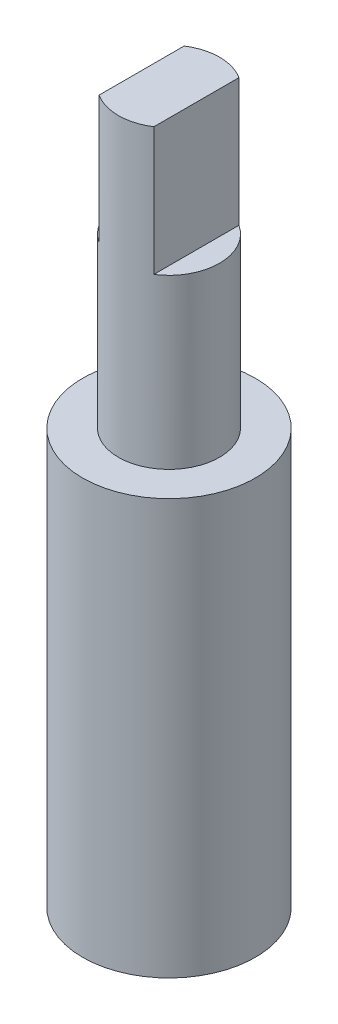
ISO-10303-21;
HEADER;
FILE_DESCRIPTION(('STEP AP214'),'2;1');
FILE_NAME('part.step','',(''),(''),'','','');
FILE_SCHEMA(('AUTOMOTIVE_DESIGN { 1 0 10303 214 1 1 1 1 }'));
ENDSEC;
DATA;
#1=APPLICATION_CONTEXT('core data for automotive mechanical design processes');
#2=APPLICATION_PROTOCOL_DEFINITION('international standard','automotive_design',2000,#1);
#3=PRODUCT_CONTEXT('',#1,'mechanical');
#4=PRODUCT('Part','Part','',(#3));
#5=PRODUCT_RELATED_PRODUCT_CATEGORY('part','',(#4));
#6=PRODUCT_DEFINITION_FORMATION('','',#4);
#7=PRODUCT_DEFINITION_CONTEXT('part definition',#1,'design');
#8=PRODUCT_DEFINITION('design','',#6,#7);
#9=PRODUCT_DEFINITION_SHAPE('','',#8);
#10=(LENGTH_UNIT() NAMED_UNIT(*) SI_UNIT(.MILLI.,.METRE.));
#11=(NAMED_UNIT(*) PLANE_ANGLE_UNIT() SI_UNIT($,.RADIAN.));
#12=(NAMED_UNIT(*) SI_UNIT($,.STERADIAN.) SOLID_ANGLE_UNIT());
#13=UNCERTAINTY_MEASURE_WITH_UNIT(LENGTH_MEASURE(1.E-05),#10,'distance_accuracy_value','');
#14=(GEOMETRIC_REPRESENTATION_CONTEXT(3) GLOBAL_UNCERTAINTY_ASSIGNED_CONTEXT((#13)) GLOBAL_UNIT_ASSIGNED_CONTEXT((#10,
#11,#12)) REPRESENTATION_CONTEXT('',''));
#15=CARTESIAN_POINT('',(0.,0.,0.));
#16=DIRECTION('',(0.,0.,1.));
#17=DIRECTION('',(1.,0.,0.));
#18=AXIS2_PLACEMENT_3D('',#15,#16,#17);
#19=CARTESIAN_POINT('',(0.,20.75,0.));
#20=DIRECTION('',(0.,1.,0.));
#21=DIRECTION('',(0.,0.,1.));
#22=AXIS2_PLACEMENT_3D('',#19,#20,#21);
#23=PLANE('',#22);
#24=DIRECTION('',(0.,0.,-1.));
#25=VECTOR('',#24,1.);
#26=CARTESIAN_POINT('',(0.975,20.75,-1.5130680751374));
#27=LINE('',#26,#25);
#28=CARTESIAN_POINT('',(0.975,20.75,1.5130680751374));
#29=VERTEX_POINT('',#28);
#30=CARTESIAN_POINT('',(0.975,20.75,-1.5130680751374));
#31=VERTEX_POINT('',#30);
#32=EDGE_CURVE('E104',#29,#31,#27,.T.);
#33=ORIENTED_EDGE('',*,*,#32,.F.);
#34=CARTESIAN_POINT('',(0.,20.75,0.));
#35=DIRECTION('',(0.,1.,0.));
#36=DIRECTION('',(0.,0.,1.));
#37=AXIS2_PLACEMENT_3D('',#34,#35,#36);
#38=CIRCLE('',#37,1.8);
#39=EDGE_CURVE('E63',#29,#31,#38,.T.);
#40=ORIENTED_EDGE('',*,*,#39,.T.);
#41=EDGE_LOOP('',(#33,#40));
#42=FACE_BOUND('',#41,.T.);
#43=ADVANCED_FACE('F39',(#42),#23,.T.);
#44=CARTESIAN_POINT('',(0.,14.77,0.));
#45=DIRECTION('',(0.,-1.,0.));
#46=DIRECTION('',(0.,0.,-1.));
#47=AXIS2_PLACEMENT_3D('',#44,#45,#46);
#48=CYLINDRICAL_SURFACE('',#47,3.075);
#49=CARTESIAN_POINT('',(0.,14.77,0.));
#50=DIRECTION('',(0.,1.,0.));
#51=DIRECTION('',(0.,0.,1.));
#52=AXIS2_PLACEMENT_3D('',#49,#50,#51);
#53=CIRCLE('',#52,3.075);
#54=CARTESIAN_POINT('',(0.,14.77,3.075));
#55=VERTEX_POINT('',#54);
#56=EDGE_CURVE('E49',#55,#55,#53,.T.);
#57=ORIENTED_EDGE('',*,*,#56,.F.);
#58=EDGE_LOOP('',(#57));
#59=FACE_BOUND('',#58,.T.);
#60=CARTESIAN_POINT('',(0.,0.,0.));
#61=DIRECTION('',(0.,1.,0.));
#62=DIRECTION('',(0.,0.,1.));
#63=AXIS2_PLACEMENT_3D('',#60,#61,#62);
#64=CIRCLE('',#63,3.075);
#65=CARTESIAN_POINT('',(0.,0.,3.075));
#66=VERTEX_POINT('',#65);
#67=EDGE_CURVE('E43',#66,#66,#64,.T.);
#68=ORIENTED_EDGE('',*,*,#67,.T.);
#69=EDGE_LOOP('',(#68));
#70=FACE_BOUND('',#69,.T.);
#71=ADVANCED_FACE('F41',(#59,#70),#48,.T.);
#72=CARTESIAN_POINT('',(0.,14.77,0.));
#73=DIRECTION('',(0.,1.,0.));
#74=DIRECTION('',(0.,0.,1.));
#75=AXIS2_PLACEMENT_3D('',#72,#73,#74);
#76=PLANE('',#75);
#77=CARTESIAN_POINT('',(0.,14.77,0.));
#78=DIRECTION('',(0.,1.,0.));
#79=DIRECTION('',(0.,0.,1.));
#80=AXIS2_PLACEMENT_3D('',#77,#78,#79);
#81=CIRCLE('',#80,1.8);
#82=CARTESIAN_POINT('',(0.,14.77,1.8));
#83=VERTEX_POINT('',#82);
#84=EDGE_CURVE('E11',#83,#83,#81,.T.);
#85=ORIENTED_EDGE('',*,*,#84,.F.);
#86=EDGE_LOOP('',(#85));
#87=FACE_BOUND('',#86,.T.);
#88=ORIENTED_EDGE('',*,*,#56,.T.);
#89=EDGE_LOOP('',(#88));
#90=FACE_BOUND('',#89,.T.);
#91=ADVANCED_FACE('F129',(#87,#90),#76,.T.);
#92=CARTESIAN_POINT('',(0.,0.,0.));
#93=DIRECTION('',(0.,1.,0.));
#94=DIRECTION('',(0.,0.,1.));
#95=AXIS2_PLACEMENT_3D('',#92,#93,#94);
#96=PLANE('',#95);
#97=CARTESIAN_POINT('',(0.,0.,0.));
#98=DIRECTION('',(0.,-1.,0.));
#99=DIRECTION('',(0.,0.,-1.));
#100=AXIS2_PLACEMENT_3D('',#97,#98,#99);
#101=CIRCLE('',#100,2.15);
#102=CARTESIAN_POINT('',(0.,0.,-2.15));
#103=VERTEX_POINT('',#102);
#104=EDGE_CURVE('E173',#103,#103,#101,.T.);
#105=ORIENTED_EDGE('',*,*,#104,.F.);
#106=EDGE_LOOP('',(#105));
#107=FACE_BOUND('',#106,.T.);
#108=ORIENTED_EDGE('',*,*,#67,.F.);
#109=EDGE_LOOP('',(#108));
#110=FACE_BOUND('',#109,.T.);
#111=ADVANCED_FACE('F127',(#107,#110),#96,.F.);
#112=CARTESIAN_POINT('',(0.,20.75,0.));
#113=DIRECTION('',(0.,-1.,0.));
#114=DIRECTION('',(0.,0.,-1.));
#115=AXIS2_PLACEMENT_3D('',#112,#113,#114);
#116=CYLINDRICAL_SURFACE('',#115,1.8);
#117=ORIENTED_EDGE('',*,*,#39,.F.);
#118=DIRECTION('',(0.,-1.,0.));
#119=VECTOR('',#118,1.);
#120=CARTESIAN_POINT('',(0.975,25.3,1.5130680751374));
#121=LINE('',#120,#119);
#122=CARTESIAN_POINT('',(0.975,25.3,1.5130680751374));
#123=VERTEX_POINT('',#122);
#124=EDGE_CURVE('E114',#123,#29,#121,.T.);
#125=ORIENTED_EDGE('',*,*,#124,.F.);
#126=CARTESIAN_POINT('',(0.,25.3,0.));
#127=DIRECTION('',(0.,1.,0.));
#128=DIRECTION('',(0.,0.,1.));
#129=AXIS2_PLACEMENT_3D('',#126,#127,#128);
#130=CIRCLE('',#129,1.8);
#131=CARTESIAN_POINT('',(-0.975,25.3,1.5130680751374));
#132=VERTEX_POINT('',#131);
#133=EDGE_CURVE('E93',#132,#123,#130,.T.);
#134=ORIENTED_EDGE('',*,*,#133,.F.);
#135=DIRECTION('',(0.,-1.,0.));
#136=VECTOR('',#135,1.);
#137=CARTESIAN_POINT('',(-0.975,25.3,1.5130680751374));
#138=LINE('',#137,#136);
#139=CARTESIAN_POINT('',(-0.975,20.75,1.5130680751374));
#140=VERTEX_POINT('',#139);
#141=EDGE_CURVE('E89',#132,#140,#138,.T.);
#142=ORIENTED_EDGE('',*,*,#141,.T.);
#143=CARTESIAN_POINT('',(-0.975,20.75,-1.5130680751374));
#144=VERTEX_POINT('',#143);
#145=EDGE_CURVE('E108',#144,#140,#38,.T.);
#146=ORIENTED_EDGE('',*,*,#145,.F.);
#147=DIRECTION('',(0.,-1.,0.));
#148=VECTOR('',#147,1.);
#149=CARTESIAN_POINT('',(-0.975,25.3,-1.5130680751374));
#150=LINE('',#149,#148);
#151=CARTESIAN_POINT('',(-0.975,25.3,-1.5130680751374));
#152=VERTEX_POINT('',#151);
#153=EDGE_CURVE('E87',#152,#144,#150,.T.);
#154=ORIENTED_EDGE('',*,*,#153,.F.);
#155=CARTESIAN_POINT('',(0.,25.3,0.));
#156=DIRECTION('',(0.,1.,0.));
#157=DIRECTION('',(0.,0.,1.));
#158=AXIS2_PLACEMENT_3D('',#155,#156,#157);
#159=CIRCLE('',#158,1.8);
#160=CARTESIAN_POINT('',(0.975,25.3,-1.5130680751374));
#161=VERTEX_POINT('',#160);
#162=EDGE_CURVE('E94',#161,#152,#159,.T.);
#163=ORIENTED_EDGE('',*,*,#162,.F.);
#164=DIRECTION('',(0.,-1.,0.));
#165=VECTOR('',#164,1.);
#166=CARTESIAN_POINT('',(0.975,25.3,-1.5130680751374));
#167=LINE('',#166,#165);
#168=EDGE_CURVE('E184',#161,#31,#167,.T.);
#169=ORIENTED_EDGE('',*,*,#168,.T.);
#170=EDGE_LOOP('',(#117,#125,#134,#142,#146,#154,#163,#169));
#171=FACE_BOUND('',#170,.T.);
#172=ORIENTED_EDGE('',*,*,#84,.T.);
#173=EDGE_LOOP('',(#172));
#174=FACE_BOUND('',#173,.T.);
#175=ADVANCED_FACE('F106',(#171,#174),#116,.T.);
#176=DIRECTION('',(0.,0.,1.));
#177=VECTOR('',#176,1.);
#178=CARTESIAN_POINT('',(-0.975,20.75,-1.5130680751374));
#179=LINE('',#178,#177);
#180=EDGE_CURVE('E56',#144,#140,#179,.T.);
#181=ORIENTED_EDGE('',*,*,#180,.F.);
#182=ORIENTED_EDGE('',*,*,#145,.T.);
#183=EDGE_LOOP('',(#181,#182));
#184=FACE_BOUND('',#183,.T.);
#185=ADVANCED_FACE('F135',(#184),#23,.T.);
#186=CARTESIAN_POINT('',(-0.975,25.3,-1.5130680751374));
#187=DIRECTION('',(1.,0.,0.));
#188=DIRECTION('',(0.,0.,-1.));
#189=AXIS2_PLACEMENT_3D('',#186,#187,#188);
#190=PLANE('',#189);
#191=ORIENTED_EDGE('',*,*,#180,.T.);
#192=ORIENTED_EDGE('',*,*,#141,.F.);
#193=DIRECTION('',(0.,0.,1.));
#194=VECTOR('',#193,1.);
#195=CARTESIAN_POINT('',(-0.975,25.3,-1.5130680751374));
#196=LINE('',#195,#194);
#197=EDGE_CURVE('E83',#152,#132,#196,.T.);
#198=ORIENTED_EDGE('',*,*,#197,.F.);
#199=ORIENTED_EDGE('',*,*,#153,.T.);
#200=EDGE_LOOP('',(#191,#192,#198,#199));
#201=FACE_BOUND('',#200,.T.);
#202=ADVANCED_FACE('F85',(#201),#190,.F.);
#203=CARTESIAN_POINT('',(0.975,25.3,-1.5130680751374));
#204=DIRECTION('',(-1.,0.,0.));
#205=DIRECTION('',(0.,0.,1.));
#206=AXIS2_PLACEMENT_3D('',#203,#204,#205);
#207=PLANE('',#206);
#208=ORIENTED_EDGE('',*,*,#32,.T.);
#209=ORIENTED_EDGE('',*,*,#168,.F.);
#210=DIRECTION('',(0.,0.,-1.));
#211=VECTOR('',#210,1.);
#212=CARTESIAN_POINT('',(0.975,25.3,-1.5130680751374));
#213=LINE('',#212,#211);
#214=EDGE_CURVE('E99',#123,#161,#213,.T.);
#215=ORIENTED_EDGE('',*,*,#214,.F.);
#216=ORIENTED_EDGE('',*,*,#124,.T.);
#217=EDGE_LOOP('',(#208,#209,#215,#216));
#218=FACE_BOUND('',#217,.T.);
#219=ADVANCED_FACE('F151',(#218),#207,.F.);
#220=CARTESIAN_POINT('',(0.,25.3,0.));
#221=DIRECTION('',(0.,1.,0.));
#222=DIRECTION('',(0.,0.,1.));
#223=AXIS2_PLACEMENT_3D('',#220,#221,#222);
#224=PLANE('',#223);
#225=ORIENTED_EDGE('',*,*,#162,.T.);
#226=ORIENTED_EDGE('',*,*,#197,.T.);
#227=ORIENTED_EDGE('',*,*,#133,.T.);
#228=ORIENTED_EDGE('',*,*,#214,.T.);
#229=EDGE_LOOP('',(#225,#226,#227,#228));
#230=FACE_BOUND('',#229,.T.);
#231=ADVANCED_FACE('F97',(#230),#224,.T.);
#232=CARTESIAN_POINT('',(0.,1.95,0.));
#233=DIRECTION('',(0.,-1.,0.));
#234=DIRECTION('',(0.,0.,-1.));
#235=AXIS2_PLACEMENT_3D('',#232,#233,#234);
#236=CYLINDRICAL_SURFACE('',#235,2.15);
#237=CARTESIAN_POINT('',(0.,1.95,0.));
#238=DIRECTION('',(0.,-1.,0.));
#239=DIRECTION('',(0.,0.,-1.));
#240=AXIS2_PLACEMENT_3D('',#237,#238,#239);
#241=CIRCLE('',#240,2.15);
#242=CARTESIAN_POINT('',(0.,1.95,-2.15));
#243=VERTEX_POINT('',#242);
#244=EDGE_CURVE('E171',#243,#243,#241,.T.);
#245=ORIENTED_EDGE('',*,*,#244,.F.);
#246=EDGE_LOOP('',(#245));
#247=FACE_BOUND('',#246,.T.);
#248=ORIENTED_EDGE('',*,*,#104,.T.);
#249=EDGE_LOOP('',(#248));
#250=FACE_BOUND('',#249,.T.);
#251=ADVANCED_FACE('F160',(#247,#250),#236,.F.);
#252=CARTESIAN_POINT('',(0.,1.95,0.));
#253=DIRECTION('',(0.,-1.,0.));
#254=DIRECTION('',(0.,0.,-1.));
#255=AXIS2_PLACEMENT_3D('',#252,#253,#254);
#256=PLANE('',#255);
#257=ORIENTED_EDGE('',*,*,#244,.T.);
#258=EDGE_LOOP('',(#257));
#259=FACE_BOUND('',#258,.T.);
#260=ADVANCED_FACE('F163',(#259),#256,.T.);
#261=CLOSED_SHELL('',(#43,#71,#91,#111,#175,#185,#202,#219,#231,#251,#260));
#262=MANIFOLD_SOLID_BREP('B2',#261);
#263=ADVANCED_BREP_SHAPE_REPRESENTATION('',(#18,#262),#14);
#264=SHAPE_DEFINITION_REPRESENTATION(#9,#263);
ENDSEC;
END-ISO-10303-21;
